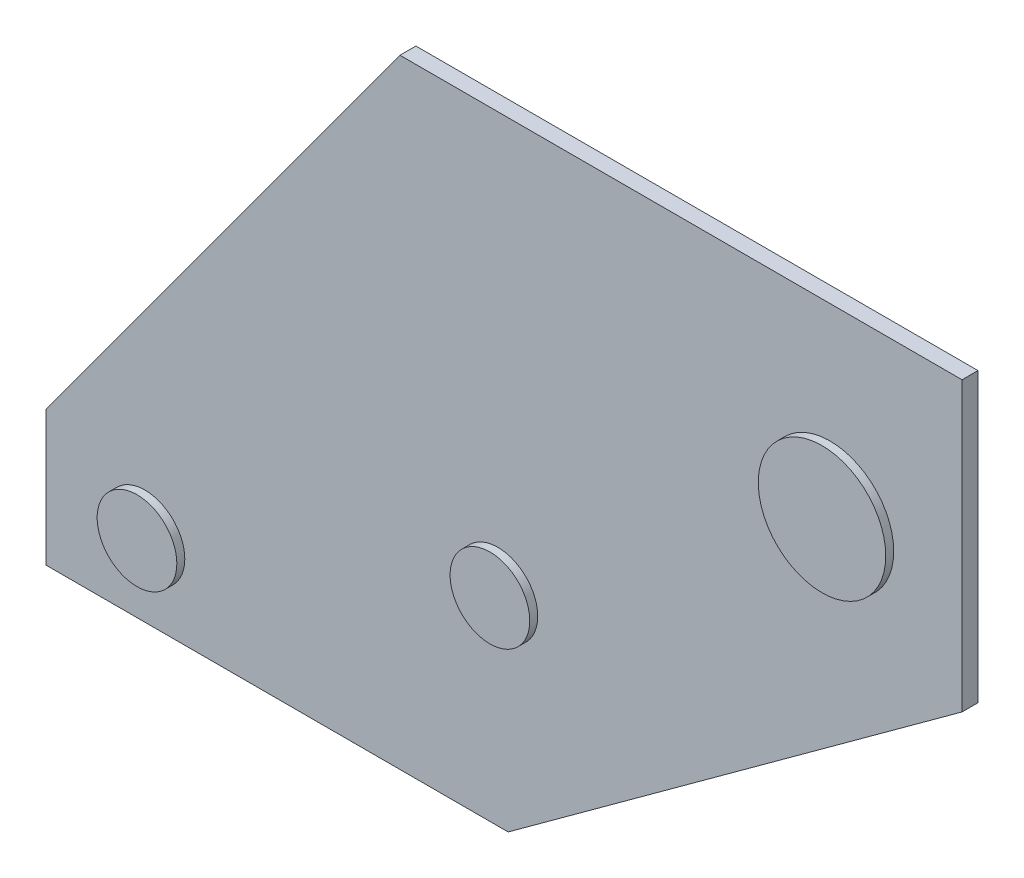
ISO-10303-21;
HEADER;
FILE_DESCRIPTION(('STEP AP214'),'2;1');
FILE_NAME('part.step','',(''),(''),'','','');
FILE_SCHEMA(('AUTOMOTIVE_DESIGN { 1 0 10303 214 1 1 1 1 }'));
ENDSEC;
DATA;
#1=APPLICATION_CONTEXT('core data for automotive mechanical design processes');
#2=APPLICATION_PROTOCOL_DEFINITION('international standard','automotive_design',2000,#1);
#3=PRODUCT_CONTEXT('',#1,'mechanical');
#4=PRODUCT('Part','Part','',(#3));
#5=PRODUCT_RELATED_PRODUCT_CATEGORY('part','',(#4));
#6=PRODUCT_DEFINITION_FORMATION('','',#4);
#7=PRODUCT_DEFINITION_CONTEXT('part definition',#1,'design');
#8=PRODUCT_DEFINITION('design','',#6,#7);
#9=PRODUCT_DEFINITION_SHAPE('','',#8);
#10=(LENGTH_UNIT() NAMED_UNIT(*) SI_UNIT(.MILLI.,.METRE.));
#11=(NAMED_UNIT(*) PLANE_ANGLE_UNIT() SI_UNIT($,.RADIAN.));
#12=(NAMED_UNIT(*) SI_UNIT($,.STERADIAN.) SOLID_ANGLE_UNIT());
#13=UNCERTAINTY_MEASURE_WITH_UNIT(LENGTH_MEASURE(1.E-05),#10,'distance_accuracy_value','');
#14=(GEOMETRIC_REPRESENTATION_CONTEXT(3) GLOBAL_UNCERTAINTY_ASSIGNED_CONTEXT((#13)) GLOBAL_UNIT_ASSIGNED_CONTEXT((#10,
#11,#12)) REPRESENTATION_CONTEXT('',''));
#15=CARTESIAN_POINT('',(0.,0.,0.));
#16=DIRECTION('',(0.,0.,1.));
#17=DIRECTION('',(1.,0.,0.));
#18=AXIS2_PLACEMENT_3D('',#15,#16,#17);
#19=CARTESIAN_POINT('',(0.,95.25,17.78));
#20=DIRECTION('',(0.,0.,1.));
#21=DIRECTION('',(1.,0.,0.));
#22=AXIS2_PLACEMENT_3D('',#19,#20,#21);
#23=PLANE('',#22);
#24=CARTESIAN_POINT('',(169.162580271859,15.0943779158976,17.78));
#25=DIRECTION('',(0.,0.,1.));
#26=DIRECTION('',(1.,0.,0.));
#27=AXIS2_PLACEMENT_3D('',#24,#25,#26);
#28=CIRCLE('',#27,5.07999999999999);
#29=CARTESIAN_POINT('',(174.242580271859,15.0943779158976,17.78));
#30=VERTEX_POINT('',#29);
#31=EDGE_CURVE('E11',#30,#30,#28,.T.);
#32=ORIENTED_EDGE('',*,*,#31,.T.);
#33=EDGE_LOOP('',(#32));
#34=FACE_BOUND('',#33,.T.);
#35=ADVANCED_FACE('F37',(#34),#23,.T.);
#36=CARTESIAN_POINT('',(169.162580271859,15.0943779158976,17.145));
#37=DIRECTION('',(0.,0.,1.));
#38=DIRECTION('',(1.,0.,0.));
#39=AXIS2_PLACEMENT_3D('',#36,#37,#38);
#40=CYLINDRICAL_SURFACE('',#39,5.07999999999999);
#41=CARTESIAN_POINT('',(169.162580271859,15.0943779158976,17.145));
#42=DIRECTION('',(0.,0.,1.));
#43=DIRECTION('',(0.,-1.,0.));
#44=AXIS2_PLACEMENT_3D('',#41,#42,#43);
#45=CIRCLE('',#44,5.07999999999999);
#46=CARTESIAN_POINT('',(174.242580271859,15.0943779158976,17.145));
#47=VERTEX_POINT('',#46);
#48=EDGE_CURVE('E44',#47,#47,#45,.F.);
#49=CARTESIAN_POINT('',(174.242580271859,15.0943779158976,17.145));
#50=CARTESIAN_POINT('',(174.242580271859,15.0943779158976,17.1516145833333));
#51=CARTESIAN_POINT('',(174.242580271859,15.0943779158976,17.1582291666667));
#52=CARTESIAN_POINT('',(174.242580271859,15.0943779158976,17.1714583333333));
#53=CARTESIAN_POINT('',(174.242580271859,15.0943779158976,17.1780729166667));
#54=CARTESIAN_POINT('',(174.242580271859,15.0943779158976,17.1913020833333));
#55=CARTESIAN_POINT('',(174.242580271859,15.0943779158976,17.1979166666667));
#56=CARTESIAN_POINT('',(174.242580271859,15.0943779158976,17.2111458333333));
#57=CARTESIAN_POINT('',(174.242580271859,15.0943779158976,17.2177604166667));
#58=CARTESIAN_POINT('',(174.242580271859,15.0943779158976,17.2309895833333));
#59=CARTESIAN_POINT('',(174.242580271859,15.0943779158976,17.2376041666667));
#60=CARTESIAN_POINT('',(174.242580271859,15.0943779158976,17.2508333333333));
#61=CARTESIAN_POINT('',(174.242580271859,15.0943779158976,17.2574479166667));
#62=CARTESIAN_POINT('',(174.242580271859,15.0943779158976,17.2706770833333));
#63=CARTESIAN_POINT('',(174.242580271859,15.0943779158976,17.2772916666667));
#64=CARTESIAN_POINT('',(174.242580271859,15.0943779158976,17.2905208333333));
#65=CARTESIAN_POINT('',(174.242580271859,15.0943779158976,17.2971354166667));
#66=CARTESIAN_POINT('',(174.242580271859,15.0943779158976,17.3103645833333));
#67=CARTESIAN_POINT('',(174.242580271859,15.0943779158976,17.3169791666667));
#68=CARTESIAN_POINT('',(174.242580271859,15.0943779158976,17.3302083333333));
#69=CARTESIAN_POINT('',(174.242580271859,15.0943779158976,17.3368229166667));
#70=CARTESIAN_POINT('',(174.242580271859,15.0943779158976,17.3500520833333));
#71=CARTESIAN_POINT('',(174.242580271859,15.0943779158976,17.3566666666667));
#72=CARTESIAN_POINT('',(174.242580271859,15.0943779158976,17.3698958333333));
#73=CARTESIAN_POINT('',(174.242580271859,15.0943779158976,17.3765104166667));
#74=CARTESIAN_POINT('',(174.242580271859,15.0943779158976,17.3897395833333));
#75=CARTESIAN_POINT('',(174.242580271859,15.0943779158976,17.3963541666667));
#76=CARTESIAN_POINT('',(174.242580271859,15.0943779158976,17.4095833333333));
#77=CARTESIAN_POINT('',(174.242580271859,15.0943779158976,17.4161979166667));
#78=CARTESIAN_POINT('',(174.242580271859,15.0943779158976,17.4294270833333));
#79=CARTESIAN_POINT('',(174.242580271859,15.0943779158976,17.4360416666667));
#80=CARTESIAN_POINT('',(174.242580271859,15.0943779158976,17.4492708333333));
#81=CARTESIAN_POINT('',(174.242580271859,15.0943779158976,17.4558854166667));
#82=CARTESIAN_POINT('',(174.242580271859,15.0943779158976,17.4691145833333));
#83=CARTESIAN_POINT('',(174.242580271859,15.0943779158976,17.4757291666667));
#84=CARTESIAN_POINT('',(174.242580271859,15.0943779158976,17.4889583333333));
#85=CARTESIAN_POINT('',(174.242580271859,15.0943779158976,17.4955729166667));
#86=CARTESIAN_POINT('',(174.242580271859,15.0943779158976,17.5088020833333));
#87=CARTESIAN_POINT('',(174.242580271859,15.0943779158976,17.5154166666667));
#88=CARTESIAN_POINT('',(174.242580271859,15.0943779158976,17.5286458333333));
#89=CARTESIAN_POINT('',(174.242580271859,15.0943779158976,17.5352604166667));
#90=CARTESIAN_POINT('',(174.242580271859,15.0943779158976,17.5484895833333));
#91=CARTESIAN_POINT('',(174.242580271859,15.0943779158976,17.5551041666667));
#92=CARTESIAN_POINT('',(174.242580271859,15.0943779158976,17.5683333333333));
#93=CARTESIAN_POINT('',(174.242580271859,15.0943779158976,17.5749479166667));
#94=CARTESIAN_POINT('',(174.242580271859,15.0943779158976,17.5881770833333));
#95=CARTESIAN_POINT('',(174.242580271859,15.0943779158976,17.5947916666667));
#96=CARTESIAN_POINT('',(174.242580271859,15.0943779158976,17.6080208333333));
#97=CARTESIAN_POINT('',(174.242580271859,15.0943779158976,17.6146354166667));
#98=CARTESIAN_POINT('',(174.242580271859,15.0943779158976,17.6278645833333));
#99=CARTESIAN_POINT('',(174.242580271859,15.0943779158976,17.6344791666667));
#100=CARTESIAN_POINT('',(174.242580271859,15.0943779158976,17.6477083333333));
#101=CARTESIAN_POINT('',(174.242580271859,15.0943779158976,17.6543229166667));
#102=CARTESIAN_POINT('',(174.242580271859,15.0943779158976,17.6675520833333));
#103=CARTESIAN_POINT('',(174.242580271859,15.0943779158976,17.6741666666667));
#104=CARTESIAN_POINT('',(174.242580271859,15.0943779158976,17.6873958333333));
#105=CARTESIAN_POINT('',(174.242580271859,15.0943779158976,17.6940104166667));
#106=CARTESIAN_POINT('',(174.242580271859,15.0943779158976,17.7072395833333));
#107=CARTESIAN_POINT('',(174.242580271859,15.0943779158976,17.7138541666667));
#108=CARTESIAN_POINT('',(174.242580271859,15.0943779158976,17.7270833333333));
#109=CARTESIAN_POINT('',(174.242580271859,15.0943779158976,17.7336979166667));
#110=CARTESIAN_POINT('',(174.242580271859,15.0943779158976,17.7469270833333));
#111=CARTESIAN_POINT('',(174.242580271859,15.0943779158976,17.7535416666667));
#112=CARTESIAN_POINT('',(174.242580271859,15.0943779158976,17.7667708333333));
#113=CARTESIAN_POINT('',(174.242580271859,15.0943779158976,17.7733854166667));
#114=CARTESIAN_POINT('',(174.242580271859,15.0943779158976,17.78));
#115=B_SPLINE_CURVE_WITH_KNOTS('',3,(#49,#50,#51,#52,#53,#54,#55,#56,#57,#58,#59,#60,#61,#62,
#63,#64,#65,#66,#67,#68,#69,#70,#71,#72,#73,#74,#75,#76,#77,#78,#79,#80,#81,#82,#83,#84,#85,#86,
#87,#88,#89,#90,#91,#92,#93,#94,#95,#96,#97,#98,#99,#100,#101,#102,#103,#104,#105,#106,#107,
#108,#109,#110,#111,#112,#113,#114),.UNSPECIFIED.,.F.,.F.,(4,2,2,2,2,2,2,2,2,2,2,2,2,2,2,2,2,2,
2,2,2,2,2,2,2,2,2,2,2,2,2,2,4),(0.,0.0198437499999982,0.0396874999999963,0.059531249999998,
0.0793749999999961,0.0992187499999977,0.119062499999996,0.138906249999998,0.158749999999996,
0.178593749999997,0.198437499999995,0.218281249999997,0.238124999999995,0.257968749999997,
0.277812499999995,0.297656249999997,0.317499999999995,0.337343749999993,0.357187499999995,
0.377031249999993,0.396874999999994,0.416718749999993,0.436562499999994,0.456406249999992,
0.476249999999994,0.496093749999992,0.515937499999994,0.535781249999992,0.555624999999994,
0.575468749999992,0.595312499999993,0.615156249999992,0.634999999999993),.UNSPECIFIED.);
#116=EDGE_CURVE('BSEAM134',#47,#30,#115,.T.);
#117=ORIENTED_EDGE('',*,*,#48,.F.);
#118=ORIENTED_EDGE('',*,*,#31,.F.);
#119=ORIENTED_EDGE('',*,*,#116,.T.);
#120=ORIENTED_EDGE('',*,*,#116,.F.);
#121=EDGE_LOOP('',(#117,#119,#118,#120));
#122=FACE_BOUND('',#121,.T.);
#123=ADVANCED_FACE('F134',(#122),#40,.T.);
#124=CARTESIAN_POINT('',(140.221286591732,73.2864974747366,17.145));
#125=DIRECTION('',(0.,0.,1.));
#126=DIRECTION('',(0.,-1.,0.));
#127=AXIS2_PLACEMENT_3D('',#124,#125,#126);
#128=PLANE('',#127);
#129=ORIENTED_EDGE('',*,*,#48,.T.);
#130=EDGE_LOOP('',(#129));
#131=FACE_BOUND('',#130,.T.);
#132=CARTESIAN_POINT('',(142.696248317665,-3.57618028550653,17.145));
#133=DIRECTION('',(0.,0.,1.));
#134=DIRECTION('',(0.,-1.,0.));
#135=AXIS2_PLACEMENT_3D('',#132,#133,#134);
#136=CIRCLE('',#135,3.175);
#137=CARTESIAN_POINT('',(145.871248317665,-3.57618028550653,17.145));
#138=VERTEX_POINT('',#137);
#139=EDGE_CURVE('E127',#138,#138,#136,.T.);
#140=ORIENTED_EDGE('',*,*,#139,.F.);
#141=EDGE_LOOP('',(#140));
#142=FACE_BOUND('',#141,.T.);
#143=CARTESIAN_POINT('',(114.567134268363,-13.686647879628,17.145));
#144=DIRECTION('',(0.,0.,1.));
#145=DIRECTION('',(1.,0.,0.));
#146=AXIS2_PLACEMENT_3D('',#143,#144,#145);
#147=CIRCLE('',#146,3.175);
#148=CARTESIAN_POINT('',(117.742134268363,-13.686647879628,17.145));
#149=VERTEX_POINT('',#148);
#150=EDGE_CURVE('E109',#149,#149,#147,.T.);
#151=ORIENTED_EDGE('',*,*,#150,.F.);
#152=EDGE_LOOP('',(#151));
#153=FACE_BOUND('',#152,.T.);
#154=DIRECTION('',(0.,-1.,0.));
#155=VECTOR('',#154,1.);
#156=CARTESIAN_POINT('',(106.680223984281,73.2864974747366,17.145));
#157=LINE('',#156,#155);
#158=CARTESIAN_POINT('',(106.680223984281,-8.88071395150553,17.145));
#159=VERTEX_POINT('',#158);
#160=CARTESIAN_POINT('',(106.680223984281,-19.6398719394655,17.145));
#161=VERTEX_POINT('',#160);
#162=EDGE_CURVE('E97',#159,#161,#157,.T.);
#163=ORIENTED_EDGE('',*,*,#162,.T.);
#164=DIRECTION('',(1.,0.,0.));
#165=VECTOR('',#164,1.);
#166=CARTESIAN_POINT('',(140.221286591732,-19.6398719394655,17.145));
#167=LINE('',#166,#165);
#168=CARTESIAN_POINT('',(143.514301236525,-19.6398719394655,17.145));
#169=VERTEX_POINT('',#168);
#170=EDGE_CURVE('E91',#161,#169,#167,.T.);
#171=ORIENTED_EDGE('',*,*,#170,.T.);
#172=DIRECTION('',(0.808090084814713,0.589058923049427,0.));
#173=VECTOR('',#172,1.);
#174=CARTESIAN_POINT('',(185.598060800409,11.037170821499,17.145));
#175=LINE('',#174,#173);
#176=CARTESIAN_POINT('',(179.691190027265,6.73134526862396,17.145));
#177=VERTEX_POINT('',#176);
#178=EDGE_CURVE('E94',#169,#177,#175,.T.);
#179=ORIENTED_EDGE('',*,*,#178,.T.);
#180=DIRECTION('',(0.,1.,0.));
#181=VECTOR('',#180,1.);
#182=CARTESIAN_POINT('',(179.691190027265,73.2864974747366,17.145));
#183=LINE('',#182,#181);
#184=CARTESIAN_POINT('',(179.691190027265,29.6615183056179,17.145));
#185=VERTEX_POINT('',#184);
#186=EDGE_CURVE('E102',#177,#185,#183,.T.);
#187=ORIENTED_EDGE('',*,*,#186,.T.);
#188=DIRECTION('',(-1.,0.,0.));
#189=VECTOR('',#188,1.);
#190=CARTESIAN_POINT('',(140.221286591732,29.6615183056179,17.145));
#191=LINE('',#190,#189);
#192=CARTESIAN_POINT('',(134.890546490372,29.6615183056179,17.145));
#193=VERTEX_POINT('',#192);
#194=EDGE_CURVE('E121',#185,#193,#191,.T.);
#195=ORIENTED_EDGE('',*,*,#194,.T.);
#196=DIRECTION('',(-0.590628472970903,-0.80694362065516,0.));
#197=VECTOR('',#196,1.);
#198=CARTESIAN_POINT('',(157.54196676086,60.608924200406,17.145));
#199=LINE('',#198,#197);
#200=EDGE_CURVE('E124',#193,#159,#199,.T.);
#201=ORIENTED_EDGE('',*,*,#200,.T.);
#202=EDGE_LOOP('',(#163,#171,#179,#187,#195,#201));
#203=FACE_BOUND('',#202,.T.);
#204=ADVANCED_FACE('F92',(#131,#142,#153,#203),#128,.T.);
#205=CARTESIAN_POINT('',(106.680223984281,-8.88071395150553,21.605));
#206=DIRECTION('',(-1.,0.,0.));
#207=DIRECTION('',(0.,0.,1.));
#208=AXIS2_PLACEMENT_3D('',#205,#206,#207);
#209=PLANE('',#208);
#210=DIRECTION('',(0.,0.,-1.));
#211=VECTOR('',#210,1.);
#212=CARTESIAN_POINT('',(106.680223984281,-8.88071395150553,21.605));
#213=LINE('',#212,#211);
#214=CARTESIAN_POINT('',(106.680223984281,-8.88071395150553,15.875));
#215=VERTEX_POINT('',#214);
#216=EDGE_CURVE('E116',#159,#215,#213,.T.);
#217=ORIENTED_EDGE('',*,*,#216,.T.);
#218=DIRECTION('',(0.,-1.,0.));
#219=VECTOR('',#218,1.);
#220=CARTESIAN_POINT('',(106.680223984281,95.25,15.875));
#221=LINE('',#220,#219);
#222=CARTESIAN_POINT('',(106.680223984281,-19.6398719394655,15.875));
#223=VERTEX_POINT('',#222);
#224=EDGE_CURVE('E446',#215,#223,#221,.T.);
#225=ORIENTED_EDGE('',*,*,#224,.T.);
#226=DIRECTION('',(0.,0.,-1.));
#227=VECTOR('',#226,1.);
#228=CARTESIAN_POINT('',(106.680223984281,-19.6398719394655,21.605));
#229=LINE('',#228,#227);
#230=EDGE_CURVE('E51',#161,#223,#229,.T.);
#231=ORIENTED_EDGE('',*,*,#230,.F.);
#232=ORIENTED_EDGE('',*,*,#162,.F.);
#233=EDGE_LOOP('',(#217,#225,#231,#232));
#234=FACE_BOUND('',#233,.T.);
#235=ADVANCED_FACE('F155',(#234),#209,.T.);
#236=CARTESIAN_POINT('',(106.680223984281,-19.6398719394655,21.605));
#237=DIRECTION('',(0.,-1.,0.));
#238=DIRECTION('',(0.,0.,-1.));
#239=AXIS2_PLACEMENT_3D('',#236,#237,#238);
#240=PLANE('',#239);
#241=ORIENTED_EDGE('',*,*,#230,.T.);
#242=DIRECTION('',(1.,0.,0.));
#243=VECTOR('',#242,1.);
#244=CARTESIAN_POINT('',(0.,-19.6398719394655,15.875));
#245=LINE('',#244,#243);
#246=CARTESIAN_POINT('',(143.514301236525,-19.6398719394655,15.875));
#247=VERTEX_POINT('',#246);
#248=EDGE_CURVE('E98',#223,#247,#245,.T.);
#249=ORIENTED_EDGE('',*,*,#248,.T.);
#250=DIRECTION('',(0.,0.,-1.));
#251=VECTOR('',#250,1.);
#252=CARTESIAN_POINT('',(143.514301236525,-19.6398719394655,21.605));
#253=LINE('',#252,#251);
#254=EDGE_CURVE('E59',#169,#247,#253,.T.);
#255=ORIENTED_EDGE('',*,*,#254,.F.);
#256=ORIENTED_EDGE('',*,*,#170,.F.);
#257=EDGE_LOOP('',(#241,#249,#255,#256));
#258=FACE_BOUND('',#257,.T.);
#259=ADVANCED_FACE('F105',(#258),#240,.T.);
#260=CARTESIAN_POINT('',(143.514301236525,-19.6398719394655,21.605));
#261=DIRECTION('',(0.589058923049427,-0.808090084814713,0.));
#262=DIRECTION('',(0.808090084814713,0.589058923049427,0.));
#263=AXIS2_PLACEMENT_3D('',#260,#261,#262);
#264=PLANE('',#263);
#265=ORIENTED_EDGE('',*,*,#254,.T.);
#266=DIRECTION('',(0.808090084814713,0.589058923049427,0.));
#267=VECTOR('',#266,1.);
#268=CARTESIAN_POINT('',(104.487122201668,-48.0888140610624,15.875));
#269=LINE('',#268,#267);
#270=CARTESIAN_POINT('',(179.691190027265,6.73134526862394,15.875));
#271=VERTEX_POINT('',#270);
#272=EDGE_CURVE('E479',#247,#271,#269,.T.);
#273=ORIENTED_EDGE('',*,*,#272,.T.);
#274=DIRECTION('',(0.,0.,-1.));
#275=VECTOR('',#274,1.);
#276=CARTESIAN_POINT('',(179.691190027265,6.73134526862397,21.605));
#277=LINE('',#276,#275);
#278=EDGE_CURVE('E101',#177,#271,#277,.T.);
#279=ORIENTED_EDGE('',*,*,#278,.F.);
#280=ORIENTED_EDGE('',*,*,#178,.F.);
#281=EDGE_LOOP('',(#265,#273,#279,#280));
#282=FACE_BOUND('',#281,.T.);
#283=ADVANCED_FACE('F100',(#282),#264,.T.);
#284=CARTESIAN_POINT('',(179.691190027265,6.73134526862397,21.605));
#285=DIRECTION('',(1.,0.,0.));
#286=DIRECTION('',(0.,0.,-1.));
#287=AXIS2_PLACEMENT_3D('',#284,#285,#286);
#288=PLANE('',#287);
#289=ORIENTED_EDGE('',*,*,#278,.T.);
#290=DIRECTION('',(0.,1.,0.));
#291=VECTOR('',#290,1.);
#292=CARTESIAN_POINT('',(179.691190027265,95.25,15.875));
#293=LINE('',#292,#291);
#294=CARTESIAN_POINT('',(179.691190027265,29.6615183056179,15.875));
#295=VERTEX_POINT('',#294);
#296=EDGE_CURVE('E481',#271,#295,#293,.T.);
#297=ORIENTED_EDGE('',*,*,#296,.T.);
#298=DIRECTION('',(0.,0.,-1.));
#299=VECTOR('',#298,1.);
#300=CARTESIAN_POINT('',(179.691190027265,29.6615183056179,21.605));
#301=LINE('',#300,#299);
#302=EDGE_CURVE('E107',#185,#295,#301,.T.);
#303=ORIENTED_EDGE('',*,*,#302,.F.);
#304=ORIENTED_EDGE('',*,*,#186,.F.);
#305=EDGE_LOOP('',(#289,#297,#303,#304));
#306=FACE_BOUND('',#305,.T.);
#307=ADVANCED_FACE('F180',(#306),#288,.T.);
#308=CARTESIAN_POINT('',(179.691190027265,29.6615183056179,21.605));
#309=DIRECTION('',(0.,1.,0.));
#310=DIRECTION('',(0.,0.,1.));
#311=AXIS2_PLACEMENT_3D('',#308,#309,#310);
#312=PLANE('',#311);
#313=ORIENTED_EDGE('',*,*,#302,.T.);
#314=DIRECTION('',(-1.,0.,0.));
#315=VECTOR('',#314,1.);
#316=CARTESIAN_POINT('',(0.,29.6615183056179,15.875));
#317=LINE('',#316,#315);
#318=CARTESIAN_POINT('',(134.890546490372,29.6615183056179,15.875));
#319=VERTEX_POINT('',#318);
#320=EDGE_CURVE('E484',#295,#319,#317,.T.);
#321=ORIENTED_EDGE('',*,*,#320,.T.);
#322=DIRECTION('',(0.,0.,-1.));
#323=VECTOR('',#322,1.);
#324=CARTESIAN_POINT('',(134.890546490372,29.6615183056179,21.605));
#325=LINE('',#324,#323);
#326=EDGE_CURVE('E111',#193,#319,#325,.T.);
#327=ORIENTED_EDGE('',*,*,#326,.F.);
#328=ORIENTED_EDGE('',*,*,#194,.F.);
#329=EDGE_LOOP('',(#313,#321,#327,#328));
#330=FACE_BOUND('',#329,.T.);
#331=ADVANCED_FACE('F188',(#330),#312,.T.);
#332=CARTESIAN_POINT('',(134.890546490372,29.6615183056179,21.605));
#333=DIRECTION('',(-0.80694362065516,0.590628472970903,0.));
#334=DIRECTION('',(-0.590628472970903,-0.80694362065516,0.));
#335=AXIS2_PLACEMENT_3D('',#332,#333,#334);
#336=PLANE('',#335);
#337=ORIENTED_EDGE('',*,*,#326,.T.);
#338=DIRECTION('',(-0.590628472970903,-0.80694362065516,0.));
#339=VECTOR('',#338,1.);
#340=CARTESIAN_POINT('',(119.094784161099,8.08062570002227,15.875));
#341=LINE('',#340,#339);
#342=EDGE_CURVE('E487',#319,#215,#341,.T.);
#343=ORIENTED_EDGE('',*,*,#342,.T.);
#344=ORIENTED_EDGE('',*,*,#216,.F.);
#345=ORIENTED_EDGE('',*,*,#200,.F.);
#346=EDGE_LOOP('',(#337,#343,#344,#345));
#347=FACE_BOUND('',#346,.T.);
#348=ADVANCED_FACE('F166',(#347),#336,.T.);
#349=CARTESIAN_POINT('',(0.,95.25,15.875));
#350=DIRECTION('',(0.,0.,1.));
#351=DIRECTION('',(1.,0.,0.));
#352=AXIS2_PLACEMENT_3D('',#349,#350,#351);
#353=PLANE('',#352);
#354=CARTESIAN_POINT('',(142.696248317665,-3.57618028550653,15.875));
#355=DIRECTION('',(0.,0.,1.));
#356=DIRECTION('',(1.,0.,0.));
#357=AXIS2_PLACEMENT_3D('',#354,#355,#356);
#358=CIRCLE('',#357,4.46500000000001);
#359=CARTESIAN_POINT('',(147.161248317665,-3.57618028550653,15.875));
#360=VERTEX_POINT('',#359);
#361=EDGE_CURVE('E445',#360,#360,#358,.F.);
#362=ORIENTED_EDGE('',*,*,#361,.F.);
#363=EDGE_LOOP('',(#362));
#364=FACE_BOUND('',#363,.T.);
#365=CARTESIAN_POINT('',(114.567134268363,-13.686647879628,15.875));
#366=DIRECTION('',(0.,0.,1.));
#367=DIRECTION('',(1.,0.,0.));
#368=AXIS2_PLACEMENT_3D('',#365,#366,#367);
#369=CIRCLE('',#368,4.465);
#370=CARTESIAN_POINT('',(119.032134268363,-13.686647879628,15.875));
#371=VERTEX_POINT('',#370);
#372=EDGE_CURVE('E449',#371,#371,#369,.F.);
#373=ORIENTED_EDGE('',*,*,#372,.F.);
#374=EDGE_LOOP('',(#373));
#375=FACE_BOUND('',#374,.T.);
#376=CARTESIAN_POINT('',(169.162580271859,15.0943779158976,15.875));
#377=DIRECTION('',(0.,0.,1.));
#378=DIRECTION('',(1.,0.,0.));
#379=AXIS2_PLACEMENT_3D('',#376,#377,#378);
#380=CIRCLE('',#379,4.46500000000001);
#381=CARTESIAN_POINT('',(173.627580271859,15.0943779158976,15.875));
#382=VERTEX_POINT('',#381);
#383=EDGE_CURVE('E442',#382,#382,#380,.F.);
#384=ORIENTED_EDGE('',*,*,#383,.F.);
#385=EDGE_LOOP('',(#384));
#386=FACE_BOUND('',#385,.T.);
#387=ORIENTED_EDGE('',*,*,#224,.F.);
#388=ORIENTED_EDGE('',*,*,#342,.F.);
#389=ORIENTED_EDGE('',*,*,#320,.F.);
#390=ORIENTED_EDGE('',*,*,#296,.F.);
#391=ORIENTED_EDGE('',*,*,#272,.F.);
#392=ORIENTED_EDGE('',*,*,#248,.F.);
#393=EDGE_LOOP('',(#387,#388,#389,#390,#391,#392));
#394=FACE_BOUND('',#393,.T.);
#395=ADVANCED_FACE('F205',(#364,#375,#386,#394),#353,.F.);
#396=CARTESIAN_POINT('',(114.567134268363,-13.686647879628,13.335));
#397=DIRECTION('',(0.,0.,-1.));
#398=DIRECTION('',(-1.,0.,0.));
#399=AXIS2_PLACEMENT_3D('',#396,#397,#398);
#400=PLANE('',#399);
#401=CARTESIAN_POINT('',(114.567134268363,-13.686647879628,13.335));
#402=DIRECTION('',(0.,0.,-1.));
#403=DIRECTION('',(-1.,0.,0.));
#404=AXIS2_PLACEMENT_3D('',#401,#402,#403);
#405=CIRCLE('',#404,4.465);
#406=CARTESIAN_POINT('',(110.102134268363,-13.686647879628,13.335));
#407=VERTEX_POINT('',#406);
#408=EDGE_CURVE('E456',#407,#407,#405,.T.);
#409=ORIENTED_EDGE('',*,*,#408,.T.);
#410=EDGE_LOOP('',(#409));
#411=FACE_BOUND('',#410,.T.);
#412=CARTESIAN_POINT('',(114.567134268363,-13.686647879628,13.335));
#413=DIRECTION('',(0.,0.,-1.));
#414=DIRECTION('',(-1.,0.,0.));
#415=AXIS2_PLACEMENT_3D('',#412,#413,#414);
#416=CIRCLE('',#415,1.925);
#417=CARTESIAN_POINT('',(112.642134268363,-13.686647879628,13.335));
#418=VERTEX_POINT('',#417);
#419=EDGE_CURVE('E464',#418,#418,#416,.T.);
#420=ORIENTED_EDGE('',*,*,#419,.F.);
#421=EDGE_LOOP('',(#420));
#422=FACE_BOUND('',#421,.T.);
#423=ADVANCED_FACE('F214',(#411,#422),#400,.T.);
#424=CARTESIAN_POINT('',(114.567134268363,-13.686647879628,13.335));
#425=DIRECTION('',(0.,0.,1.));
#426=DIRECTION('',(1.,0.,0.));
#427=AXIS2_PLACEMENT_3D('',#424,#425,#426);
#428=CYLINDRICAL_SURFACE('',#427,4.465);
#429=ORIENTED_EDGE('',*,*,#408,.F.);
#430=EDGE_LOOP('',(#429));
#431=FACE_BOUND('',#430,.T.);
#432=ORIENTED_EDGE('',*,*,#372,.T.);
#433=EDGE_LOOP('',(#432));
#434=FACE_BOUND('',#433,.T.);
#435=ADVANCED_FACE('F224',(#431,#434),#428,.T.);
#436=CARTESIAN_POINT('',(0.,95.25,16.78));
#437=DIRECTION('',(0.,0.,1.));
#438=DIRECTION('',(1.,0.,0.));
#439=AXIS2_PLACEMENT_3D('',#436,#437,#438);
#440=PLANE('',#439);
#441=CARTESIAN_POINT('',(114.567134268363,-13.686647879628,16.78));
#442=DIRECTION('',(0.,0.,1.));
#443=DIRECTION('',(1.,0.,0.));
#444=AXIS2_PLACEMENT_3D('',#441,#442,#443);
#445=CIRCLE('',#444,1.925);
#446=CARTESIAN_POINT('',(116.492134268363,-13.686647879628,16.78));
#447=VERTEX_POINT('',#446);
#448=EDGE_CURVE('E452',#447,#447,#445,.F.);
#449=ORIENTED_EDGE('',*,*,#448,.T.);
#450=EDGE_LOOP('',(#449));
#451=FACE_BOUND('',#450,.T.);
#452=ADVANCED_FACE('F233',(#451),#440,.F.);
#453=CARTESIAN_POINT('',(114.567134268363,-13.686647879628,23.2247222151364));
#454=DIRECTION('',(0.,0.,-1.));
#455=DIRECTION('',(-1.,0.,0.));
#456=AXIS2_PLACEMENT_3D('',#453,#454,#455);
#457=CYLINDRICAL_SURFACE('',#456,1.925);
#458=ORIENTED_EDGE('',*,*,#448,.F.);
#459=EDGE_LOOP('',(#458));
#460=FACE_BOUND('',#459,.T.);
#461=ORIENTED_EDGE('',*,*,#419,.T.);
#462=EDGE_LOOP('',(#461));
#463=FACE_BOUND('',#462,.T.);
#464=ADVANCED_FACE('F242',(#460,#463),#457,.F.);
#465=CARTESIAN_POINT('',(142.696248317665,-3.57618028550653,13.335));
#466=DIRECTION('',(0.,0.,-1.));
#467=DIRECTION('',(-1.,0.,0.));
#468=AXIS2_PLACEMENT_3D('',#465,#466,#467);
#469=PLANE('',#468);
#470=CARTESIAN_POINT('',(142.696248317665,-3.57618028550653,13.335));
#471=DIRECTION('',(0.,0.,-1.));
#472=DIRECTION('',(-1.,0.,0.));
#473=AXIS2_PLACEMENT_3D('',#470,#471,#472);
#474=CIRCLE('',#473,4.46500000000001);
#475=CARTESIAN_POINT('',(138.231248317665,-3.57618028550653,13.335));
#476=VERTEX_POINT('',#475);
#477=EDGE_CURVE('E467',#476,#476,#474,.T.);
#478=ORIENTED_EDGE('',*,*,#477,.T.);
#479=EDGE_LOOP('',(#478));
#480=FACE_BOUND('',#479,.T.);
#481=CARTESIAN_POINT('',(142.696248317665,-3.57618028550653,13.335));
#482=DIRECTION('',(0.,0.,-1.));
#483=DIRECTION('',(-1.,0.,0.));
#484=AXIS2_PLACEMENT_3D('',#481,#482,#483);
#485=CIRCLE('',#484,1.92500000000001);
#486=CARTESIAN_POINT('',(140.771248317665,-3.57618028550653,13.335));
#487=VERTEX_POINT('',#486);
#488=EDGE_CURVE('E470',#487,#487,#485,.T.);
#489=ORIENTED_EDGE('',*,*,#488,.F.);
#490=EDGE_LOOP('',(#489));
#491=FACE_BOUND('',#490,.T.);
#492=ADVANCED_FACE('F252',(#480,#491),#469,.T.);
#493=CARTESIAN_POINT('',(142.696248317665,-3.57618028550653,13.335));
#494=DIRECTION('',(0.,0.,1.));
#495=DIRECTION('',(1.,0.,0.));
#496=AXIS2_PLACEMENT_3D('',#493,#494,#495);
#497=CYLINDRICAL_SURFACE('',#496,4.46500000000001);
#498=ORIENTED_EDGE('',*,*,#477,.F.);
#499=EDGE_LOOP('',(#498));
#500=FACE_BOUND('',#499,.T.);
#501=ORIENTED_EDGE('',*,*,#361,.T.);
#502=EDGE_LOOP('',(#501));
#503=FACE_BOUND('',#502,.T.);
#504=ADVANCED_FACE('F260',(#500,#503),#497,.T.);
#505=CARTESIAN_POINT('',(0.,95.25,16.78));
#506=DIRECTION('',(0.,0.,1.));
#507=DIRECTION('',(1.,0.,0.));
#508=AXIS2_PLACEMENT_3D('',#505,#506,#507);
#509=PLANE('',#508);
#510=CARTESIAN_POINT('',(142.696248317665,-3.57618028550653,16.78));
#511=DIRECTION('',(0.,0.,1.));
#512=DIRECTION('',(1.,0.,0.));
#513=AXIS2_PLACEMENT_3D('',#510,#511,#512);
#514=CIRCLE('',#513,1.92500000000001);
#515=CARTESIAN_POINT('',(144.621248317665,-3.57618028550653,16.78));
#516=VERTEX_POINT('',#515);
#517=EDGE_CURVE('E457',#516,#516,#514,.F.);
#518=ORIENTED_EDGE('',*,*,#517,.T.);
#519=EDGE_LOOP('',(#518));
#520=FACE_BOUND('',#519,.T.);
#521=ADVANCED_FACE('F269',(#520),#509,.F.);
#522=CARTESIAN_POINT('',(142.696248317665,-3.57618028550653,23.2247222151364));
#523=DIRECTION('',(0.,0.,-1.));
#524=DIRECTION('',(-1.,0.,0.));
#525=AXIS2_PLACEMENT_3D('',#522,#523,#524);
#526=CYLINDRICAL_SURFACE('',#525,1.92500000000001);
#527=ORIENTED_EDGE('',*,*,#517,.F.);
#528=EDGE_LOOP('',(#527));
#529=FACE_BOUND('',#528,.T.);
#530=ORIENTED_EDGE('',*,*,#488,.T.);
#531=EDGE_LOOP('',(#530));
#532=FACE_BOUND('',#531,.T.);
#533=ADVANCED_FACE('F278',(#529,#532),#526,.F.);
#534=CARTESIAN_POINT('',(169.162580271859,15.0943779158976,13.335));
#535=DIRECTION('',(0.,0.,-1.));
#536=DIRECTION('',(-1.,0.,0.));
#537=AXIS2_PLACEMENT_3D('',#534,#535,#536);
#538=PLANE('',#537);
#539=CARTESIAN_POINT('',(169.162580271859,15.0943779158976,13.335));
#540=DIRECTION('',(0.,0.,-1.));
#541=DIRECTION('',(-1.,0.,0.));
#542=AXIS2_PLACEMENT_3D('',#539,#540,#541);
#543=CIRCLE('',#542,4.46500000000001);
#544=CARTESIAN_POINT('',(164.697580271859,15.0943779158976,13.335));
#545=VERTEX_POINT('',#544);
#546=EDGE_CURVE('E473',#545,#545,#543,.T.);
#547=ORIENTED_EDGE('',*,*,#546,.T.);
#548=EDGE_LOOP('',(#547));
#549=FACE_BOUND('',#548,.T.);
#550=CARTESIAN_POINT('',(169.162580271859,15.0943779158976,13.335));
#551=DIRECTION('',(0.,0.,-1.));
#552=DIRECTION('',(-1.,0.,0.));
#553=AXIS2_PLACEMENT_3D('',#550,#551,#552);
#554=CIRCLE('',#553,1.92500000000001);
#555=CARTESIAN_POINT('',(167.237580271859,15.0943779158976,13.335));
#556=VERTEX_POINT('',#555);
#557=EDGE_CURVE('E118',#556,#556,#554,.T.);
#558=ORIENTED_EDGE('',*,*,#557,.F.);
#559=EDGE_LOOP('',(#558));
#560=FACE_BOUND('',#559,.T.);
#561=ADVANCED_FACE('F288',(#549,#560),#538,.T.);
#562=CARTESIAN_POINT('',(169.162580271859,15.0943779158976,13.335));
#563=DIRECTION('',(0.,0.,1.));
#564=DIRECTION('',(1.,0.,0.));
#565=AXIS2_PLACEMENT_3D('',#562,#563,#564);
#566=CYLINDRICAL_SURFACE('',#565,4.46500000000001);
#567=ORIENTED_EDGE('',*,*,#546,.F.);
#568=EDGE_LOOP('',(#567));
#569=FACE_BOUND('',#568,.T.);
#570=ORIENTED_EDGE('',*,*,#383,.T.);
#571=EDGE_LOOP('',(#570));
#572=FACE_BOUND('',#571,.T.);
#573=ADVANCED_FACE('F296',(#569,#572),#566,.T.);
#574=CARTESIAN_POINT('',(0.,95.25,16.78));
#575=DIRECTION('',(0.,0.,1.));
#576=DIRECTION('',(1.,0.,0.));
#577=AXIS2_PLACEMENT_3D('',#574,#575,#576);
#578=PLANE('',#577);
#579=CARTESIAN_POINT('',(169.162580271859,15.0943779158976,16.78));
#580=DIRECTION('',(0.,0.,1.));
#581=DIRECTION('',(1.,0.,0.));
#582=AXIS2_PLACEMENT_3D('',#579,#580,#581);
#583=CIRCLE('',#582,1.92500000000001);
#584=CARTESIAN_POINT('',(171.087580271859,15.0943779158976,16.78));
#585=VERTEX_POINT('',#584);
#586=EDGE_CURVE('E453',#585,#585,#583,.F.);
#587=ORIENTED_EDGE('',*,*,#586,.T.);
#588=EDGE_LOOP('',(#587));
#589=FACE_BOUND('',#588,.T.);
#590=ADVANCED_FACE('F305',(#589),#578,.F.);
#591=CARTESIAN_POINT('',(169.162580271859,15.0943779158976,23.2247222151364));
#592=DIRECTION('',(0.,0.,-1.));
#593=DIRECTION('',(-1.,0.,0.));
#594=AXIS2_PLACEMENT_3D('',#591,#592,#593);
#595=CYLINDRICAL_SURFACE('',#594,1.92500000000001);
#596=ORIENTED_EDGE('',*,*,#586,.F.);
#597=EDGE_LOOP('',(#596));
#598=FACE_BOUND('',#597,.T.);
#599=ORIENTED_EDGE('',*,*,#557,.T.);
#600=EDGE_LOOP('',(#599));
#601=FACE_BOUND('',#600,.T.);
#602=ADVANCED_FACE('F165',(#598,#601),#595,.F.);
#603=CARTESIAN_POINT('',(0.,95.25,17.78));
#604=DIRECTION('',(0.,0.,1.));
#605=DIRECTION('',(1.,0.,0.));
#606=AXIS2_PLACEMENT_3D('',#603,#604,#605);
#607=PLANE('',#606);
#608=CARTESIAN_POINT('',(114.567134268363,-13.686647879628,17.78));
#609=DIRECTION('',(0.,0.,1.));
#610=DIRECTION('',(1.,0.,0.));
#611=AXIS2_PLACEMENT_3D('',#608,#609,#610);
#612=CIRCLE('',#611,3.175);
#613=CARTESIAN_POINT('',(117.742134268363,-13.686647879628,17.78));
#614=VERTEX_POINT('',#613);
#615=EDGE_CURVE('E103',#614,#614,#612,.T.);
#616=ORIENTED_EDGE('',*,*,#615,.T.);
#617=EDGE_LOOP('',(#616));
#618=FACE_BOUND('',#617,.T.);
#619=ADVANCED_FACE('F217',(#618),#607,.T.);
#620=CARTESIAN_POINT('',(114.567134268363,-13.686647879628,17.145));
#621=DIRECTION('',(0.,0.,1.));
#622=DIRECTION('',(1.,0.,0.));
#623=AXIS2_PLACEMENT_3D('',#620,#621,#622);
#624=CYLINDRICAL_SURFACE('',#623,3.175);
#625=CARTESIAN_POINT('',(117.742134268363,-13.686647879628,17.145));
#626=CARTESIAN_POINT('',(117.742134268363,-13.686647879628,17.1516145833333));
#627=CARTESIAN_POINT('',(117.742134268363,-13.686647879628,17.1582291666667));
#628=CARTESIAN_POINT('',(117.742134268363,-13.686647879628,17.1714583333333));
#629=CARTESIAN_POINT('',(117.742134268363,-13.686647879628,17.1780729166667));
#630=CARTESIAN_POINT('',(117.742134268363,-13.686647879628,17.1913020833333));
#631=CARTESIAN_POINT('',(117.742134268363,-13.686647879628,17.1979166666667));
#632=CARTESIAN_POINT('',(117.742134268363,-13.686647879628,17.2111458333333));
#633=CARTESIAN_POINT('',(117.742134268363,-13.686647879628,17.2177604166667));
#634=CARTESIAN_POINT('',(117.742134268363,-13.686647879628,17.2309895833333));
#635=CARTESIAN_POINT('',(117.742134268363,-13.686647879628,17.2376041666667));
#636=CARTESIAN_POINT('',(117.742134268363,-13.686647879628,17.2508333333333));
#637=CARTESIAN_POINT('',(117.742134268363,-13.686647879628,17.2574479166667));
#638=CARTESIAN_POINT('',(117.742134268363,-13.686647879628,17.2706770833333));
#639=CARTESIAN_POINT('',(117.742134268363,-13.686647879628,17.2772916666667));
#640=CARTESIAN_POINT('',(117.742134268363,-13.686647879628,17.2905208333333));
#641=CARTESIAN_POINT('',(117.742134268363,-13.686647879628,17.2971354166667));
#642=CARTESIAN_POINT('',(117.742134268363,-13.686647879628,17.3103645833333));
#643=CARTESIAN_POINT('',(117.742134268363,-13.686647879628,17.3169791666667));
#644=CARTESIAN_POINT('',(117.742134268363,-13.686647879628,17.3302083333333));
#645=CARTESIAN_POINT('',(117.742134268363,-13.686647879628,17.3368229166667));
#646=CARTESIAN_POINT('',(117.742134268363,-13.686647879628,17.3500520833333));
#647=CARTESIAN_POINT('',(117.742134268363,-13.686647879628,17.3566666666667));
#648=CARTESIAN_POINT('',(117.742134268363,-13.686647879628,17.3698958333333));
#649=CARTESIAN_POINT('',(117.742134268363,-13.686647879628,17.3765104166667));
#650=CARTESIAN_POINT('',(117.742134268363,-13.686647879628,17.3897395833333));
#651=CARTESIAN_POINT('',(117.742134268363,-13.686647879628,17.3963541666667));
#652=CARTESIAN_POINT('',(117.742134268363,-13.686647879628,17.4095833333333));
#653=CARTESIAN_POINT('',(117.742134268363,-13.686647879628,17.4161979166667));
#654=CARTESIAN_POINT('',(117.742134268363,-13.686647879628,17.4294270833333));
#655=CARTESIAN_POINT('',(117.742134268363,-13.686647879628,17.4360416666667));
#656=CARTESIAN_POINT('',(117.742134268363,-13.686647879628,17.4492708333333));
#657=CARTESIAN_POINT('',(117.742134268363,-13.686647879628,17.4558854166667));
#658=CARTESIAN_POINT('',(117.742134268363,-13.686647879628,17.4691145833333));
#659=CARTESIAN_POINT('',(117.742134268363,-13.686647879628,17.4757291666667));
#660=CARTESIAN_POINT('',(117.742134268363,-13.686647879628,17.4889583333333));
#661=CARTESIAN_POINT('',(117.742134268363,-13.686647879628,17.4955729166667));
#662=CARTESIAN_POINT('',(117.742134268363,-13.686647879628,17.5088020833333));
#663=CARTESIAN_POINT('',(117.742134268363,-13.686647879628,17.5154166666667));
#664=CARTESIAN_POINT('',(117.742134268363,-13.686647879628,17.5286458333333));
#665=CARTESIAN_POINT('',(117.742134268363,-13.686647879628,17.5352604166667));
#666=CARTESIAN_POINT('',(117.742134268363,-13.686647879628,17.5484895833333));
#667=CARTESIAN_POINT('',(117.742134268363,-13.686647879628,17.5551041666667));
#668=CARTESIAN_POINT('',(117.742134268363,-13.686647879628,17.5683333333333));
#669=CARTESIAN_POINT('',(117.742134268363,-13.686647879628,17.5749479166667));
#670=CARTESIAN_POINT('',(117.742134268363,-13.686647879628,17.5881770833333));
#671=CARTESIAN_POINT('',(117.742134268363,-13.686647879628,17.5947916666667));
#672=CARTESIAN_POINT('',(117.742134268363,-13.686647879628,17.6080208333333));
#673=CARTESIAN_POINT('',(117.742134268363,-13.686647879628,17.6146354166667));
#674=CARTESIAN_POINT('',(117.742134268363,-13.686647879628,17.6278645833333));
#675=CARTESIAN_POINT('',(117.742134268363,-13.686647879628,17.6344791666667));
#676=CARTESIAN_POINT('',(117.742134268363,-13.686647879628,17.6477083333333));
#677=CARTESIAN_POINT('',(117.742134268363,-13.686647879628,17.6543229166667));
#678=CARTESIAN_POINT('',(117.742134268363,-13.686647879628,17.6675520833333));
#679=CARTESIAN_POINT('',(117.742134268363,-13.686647879628,17.6741666666667));
#680=CARTESIAN_POINT('',(117.742134268363,-13.686647879628,17.6873958333333));
#681=CARTESIAN_POINT('',(117.742134268363,-13.686647879628,17.6940104166667));
#682=CARTESIAN_POINT('',(117.742134268363,-13.686647879628,17.7072395833333));
#683=CARTESIAN_POINT('',(117.742134268363,-13.686647879628,17.7138541666667));
#684=CARTESIAN_POINT('',(117.742134268363,-13.686647879628,17.7270833333333));
#685=CARTESIAN_POINT('',(117.742134268363,-13.686647879628,17.7336979166667));
#686=CARTESIAN_POINT('',(117.742134268363,-13.686647879628,17.7469270833333));
#687=CARTESIAN_POINT('',(117.742134268363,-13.686647879628,17.7535416666667));
#688=CARTESIAN_POINT('',(117.742134268363,-13.686647879628,17.7667708333333));
#689=CARTESIAN_POINT('',(117.742134268363,-13.686647879628,17.7733854166667));
#690=CARTESIAN_POINT('',(117.742134268363,-13.686647879628,17.78));
#691=B_SPLINE_CURVE_WITH_KNOTS('',3,(#625,#626,#627,#628,#629,#630,#631,#632,#633,#634,#635,
#636,#637,#638,#639,#640,#641,#642,#643,#644,#645,#646,#647,#648,#649,#650,#651,#652,#653,#654,
#655,#656,#657,#658,#659,#660,#661,#662,#663,#664,#665,#666,#667,#668,#669,#670,#671,#672,#673,
#674,#675,#676,#677,#678,#679,#680,#681,#682,#683,#684,#685,#686,#687,#688,#689,#690),
.UNSPECIFIED.,.F.,.F.,(4,2,2,2,2,2,2,2,2,2,2,2,2,2,2,2,2,2,2,2,2,2,2,2,2,2,2,2,2,2,2,2,4),(0.,
0.0198437499999982,0.0396874999999998,0.059531249999998,0.0793749999999996,0.0992187499999977,
0.119062499999999,0.138906249999998,0.158749999999999,0.178593749999997,0.198437499999999,
0.218281249999997,0.238124999999999,0.257968749999997,0.277812499999999,0.297656249999997,
0.317499999999998,0.33734375,0.357187499999998,0.37703125,0.396874999999998,0.41671875,
0.436562499999998,0.456406249999999,0.476249999999998,0.496093749999999,0.515937499999997,
0.535781249999999,0.555624999999997,0.575468749999999,0.595312499999997,0.615156249999999,
0.635),.UNSPECIFIED.);
#692=EDGE_CURVE('BSEAM330',#149,#614,#691,.T.);
#693=ORIENTED_EDGE('',*,*,#150,.T.);
#694=ORIENTED_EDGE('',*,*,#615,.F.);
#695=ORIENTED_EDGE('',*,*,#692,.T.);
#696=ORIENTED_EDGE('',*,*,#692,.F.);
#697=EDGE_LOOP('',(#693,#695,#694,#696));
#698=FACE_BOUND('',#697,.T.);
#699=ADVANCED_FACE('F330',(#698),#624,.T.);
#700=CARTESIAN_POINT('',(0.,95.25,17.78));
#701=DIRECTION('',(0.,0.,1.));
#702=DIRECTION('',(1.,0.,0.));
#703=AXIS2_PLACEMENT_3D('',#700,#701,#702);
#704=PLANE('',#703);
#705=CARTESIAN_POINT('',(142.696248317665,-3.57618028550653,17.78));
#706=DIRECTION('',(0.,0.,1.));
#707=DIRECTION('',(1.,0.,0.));
#708=AXIS2_PLACEMENT_3D('',#705,#706,#707);
#709=CIRCLE('',#708,3.175);
#710=CARTESIAN_POINT('',(145.871248317665,-3.57618028550653,17.78));
#711=VERTEX_POINT('',#710);
#712=EDGE_CURVE('E435',#711,#711,#709,.T.);
#713=ORIENTED_EDGE('',*,*,#712,.T.);
#714=EDGE_LOOP('',(#713));
#715=FACE_BOUND('',#714,.T.);
#716=ADVANCED_FACE('F339',(#715),#704,.T.);
#717=CARTESIAN_POINT('',(142.696248317665,-3.57618028550653,17.145));
#718=DIRECTION('',(0.,0.,1.));
#719=DIRECTION('',(1.,0.,0.));
#720=AXIS2_PLACEMENT_3D('',#717,#718,#719);
#721=CYLINDRICAL_SURFACE('',#720,3.175);
#722=CARTESIAN_POINT('',(145.871248317665,-3.57618028550653,17.145));
#723=CARTESIAN_POINT('',(145.871248317665,-3.57618028550653,17.1516145833333));
#724=CARTESIAN_POINT('',(145.871248317665,-3.57618028550653,17.1582291666667));
#725=CARTESIAN_POINT('',(145.871248317665,-3.57618028550653,17.1714583333333));
#726=CARTESIAN_POINT('',(145.871248317665,-3.57618028550653,17.1780729166667));
#727=CARTESIAN_POINT('',(145.871248317665,-3.57618028550653,17.1913020833333));
#728=CARTESIAN_POINT('',(145.871248317665,-3.57618028550653,17.1979166666667));
#729=CARTESIAN_POINT('',(145.871248317665,-3.57618028550653,17.2111458333333));
#730=CARTESIAN_POINT('',(145.871248317665,-3.57618028550653,17.2177604166667));
#731=CARTESIAN_POINT('',(145.871248317665,-3.57618028550653,17.2309895833333));
#732=CARTESIAN_POINT('',(145.871248317665,-3.57618028550653,17.2376041666667));
#733=CARTESIAN_POINT('',(145.871248317665,-3.57618028550653,17.2508333333333));
#734=CARTESIAN_POINT('',(145.871248317665,-3.57618028550653,17.2574479166667));
#735=CARTESIAN_POINT('',(145.871248317665,-3.57618028550653,17.2706770833333));
#736=CARTESIAN_POINT('',(145.871248317665,-3.57618028550653,17.2772916666667));
#737=CARTESIAN_POINT('',(145.871248317665,-3.57618028550653,17.2905208333333));
#738=CARTESIAN_POINT('',(145.871248317665,-3.57618028550653,17.2971354166667));
#739=CARTESIAN_POINT('',(145.871248317665,-3.57618028550653,17.3103645833333));
#740=CARTESIAN_POINT('',(145.871248317665,-3.57618028550653,17.3169791666667));
#741=CARTESIAN_POINT('',(145.871248317665,-3.57618028550653,17.3302083333333));
#742=CARTESIAN_POINT('',(145.871248317665,-3.57618028550653,17.3368229166667));
#743=CARTESIAN_POINT('',(145.871248317665,-3.57618028550653,17.3500520833333));
#744=CARTESIAN_POINT('',(145.871248317665,-3.57618028550653,17.3566666666667));
#745=CARTESIAN_POINT('',(145.871248317665,-3.57618028550653,17.3698958333333));
#746=CARTESIAN_POINT('',(145.871248317665,-3.57618028550653,17.3765104166667));
#747=CARTESIAN_POINT('',(145.871248317665,-3.57618028550653,17.3897395833333));
#748=CARTESIAN_POINT('',(145.871248317665,-3.57618028550653,17.3963541666667));
#749=CARTESIAN_POINT('',(145.871248317665,-3.57618028550653,17.4095833333333));
#750=CARTESIAN_POINT('',(145.871248317665,-3.57618028550653,17.4161979166667));
#751=CARTESIAN_POINT('',(145.871248317665,-3.57618028550653,17.4294270833333));
#752=CARTESIAN_POINT('',(145.871248317665,-3.57618028550653,17.4360416666667));
#753=CARTESIAN_POINT('',(145.871248317665,-3.57618028550653,17.4492708333333));
#754=CARTESIAN_POINT('',(145.871248317665,-3.57618028550653,17.4558854166667));
#755=CARTESIAN_POINT('',(145.871248317665,-3.57618028550653,17.4691145833333));
#756=CARTESIAN_POINT('',(145.871248317665,-3.57618028550653,17.4757291666667));
#757=CARTESIAN_POINT('',(145.871248317665,-3.57618028550653,17.4889583333333));
#758=CARTESIAN_POINT('',(145.871248317665,-3.57618028550653,17.4955729166667));
#759=CARTESIAN_POINT('',(145.871248317665,-3.57618028550653,17.5088020833333));
#760=CARTESIAN_POINT('',(145.871248317665,-3.57618028550653,17.5154166666667));
#761=CARTESIAN_POINT('',(145.871248317665,-3.57618028550653,17.5286458333333));
#762=CARTESIAN_POINT('',(145.871248317665,-3.57618028550653,17.5352604166667));
#763=CARTESIAN_POINT('',(145.871248317665,-3.57618028550653,17.5484895833333));
#764=CARTESIAN_POINT('',(145.871248317665,-3.57618028550653,17.5551041666667));
#765=CARTESIAN_POINT('',(145.871248317665,-3.57618028550653,17.5683333333333));
#766=CARTESIAN_POINT('',(145.871248317665,-3.57618028550653,17.5749479166667));
#767=CARTESIAN_POINT('',(145.871248317665,-3.57618028550653,17.5881770833333));
#768=CARTESIAN_POINT('',(145.871248317665,-3.57618028550653,17.5947916666667));
#769=CARTESIAN_POINT('',(145.871248317665,-3.57618028550653,17.6080208333333));
#770=CARTESIAN_POINT('',(145.871248317665,-3.57618028550653,17.6146354166667));
#771=CARTESIAN_POINT('',(145.871248317665,-3.57618028550653,17.6278645833333));
#772=CARTESIAN_POINT('',(145.871248317665,-3.57618028550653,17.6344791666667));
#773=CARTESIAN_POINT('',(145.871248317665,-3.57618028550653,17.6477083333333));
#774=CARTESIAN_POINT('',(145.871248317665,-3.57618028550653,17.6543229166667));
#775=CARTESIAN_POINT('',(145.871248317665,-3.57618028550653,17.6675520833333));
#776=CARTESIAN_POINT('',(145.871248317665,-3.57618028550653,17.6741666666667));
#777=CARTESIAN_POINT('',(145.871248317665,-3.57618028550653,17.6873958333333));
#778=CARTESIAN_POINT('',(145.871248317665,-3.57618028550653,17.6940104166667));
#779=CARTESIAN_POINT('',(145.871248317665,-3.57618028550653,17.7072395833333));
#780=CARTESIAN_POINT('',(145.871248317665,-3.57618028550653,17.7138541666667));
#781=CARTESIAN_POINT('',(145.871248317665,-3.57618028550653,17.7270833333333));
#782=CARTESIAN_POINT('',(145.871248317665,-3.57618028550653,17.7336979166667));
#783=CARTESIAN_POINT('',(145.871248317665,-3.57618028550653,17.7469270833333));
#784=CARTESIAN_POINT('',(145.871248317665,-3.57618028550653,17.7535416666667));
#785=CARTESIAN_POINT('',(145.871248317665,-3.57618028550653,17.7667708333333));
#786=CARTESIAN_POINT('',(145.871248317665,-3.57618028550653,17.7733854166667));
#787=CARTESIAN_POINT('',(145.871248317665,-3.57618028550653,17.78));
#788=B_SPLINE_CURVE_WITH_KNOTS('',3,(#722,#723,#724,#725,#726,#727,#728,#729,#730,#731,#732,
#733,#734,#735,#736,#737,#738,#739,#740,#741,#742,#743,#744,#745,#746,#747,#748,#749,#750,#751,
#752,#753,#754,#755,#756,#757,#758,#759,#760,#761,#762,#763,#764,#765,#766,#767,#768,#769,#770,
#771,#772,#773,#774,#775,#776,#777,#778,#779,#780,#781,#782,#783,#784,#785,#786,#787),
.UNSPECIFIED.,.F.,.F.,(4,2,2,2,2,2,2,2,2,2,2,2,2,2,2,2,2,2,2,2,2,2,2,2,2,2,2,2,2,2,2,2,4),(0.,
0.0198437500000016,0.0396874999999998,0.0595312500000014,0.0793749999999996,0.0992187500000012,
0.119062499999999,0.138906249999998,0.158749999999999,0.178593749999997,0.198437499999999,
0.218281249999997,0.238124999999995,0.257968749999997,0.277812499999995,0.297656249999997,
0.317499999999995,0.337343749999993,0.357187499999995,0.377031249999993,0.396874999999994,
0.416718749999993,0.436562499999991,0.456406249999992,0.476249999999991,0.496093749999992,
0.51593749999999,0.535781249999989,0.55562499999999,0.575468749999988,0.59531249999999,
0.615156249999988,0.63499999999999),.UNSPECIFIED.);
#789=EDGE_CURVE('BSEAM342',#138,#711,#788,.T.);
#790=ORIENTED_EDGE('',*,*,#139,.T.);
#791=ORIENTED_EDGE('',*,*,#712,.F.);
#792=ORIENTED_EDGE('',*,*,#789,.T.);
#793=ORIENTED_EDGE('',*,*,#789,.F.);
#794=EDGE_LOOP('',(#790,#792,#791,#793));
#795=FACE_BOUND('',#794,.T.);
#796=ADVANCED_FACE('F342',(#795),#721,.T.);
#797=CLOSED_SHELL('',(#35,#123,#204,#235,#259,#283,#307,#331,#348,#395,#423,#435,#452,#464,#492,
#504,#521,#533,#561,#573,#590,#602,#619,#699,#716,#796));
#798=MANIFOLD_SOLID_BREP('B2',#797);
#799=ADVANCED_BREP_SHAPE_REPRESENTATION('',(#18,#798),#14);
#800=SHAPE_DEFINITION_REPRESENTATION(#9,#799);
ENDSEC;
END-ISO-10303-21;
